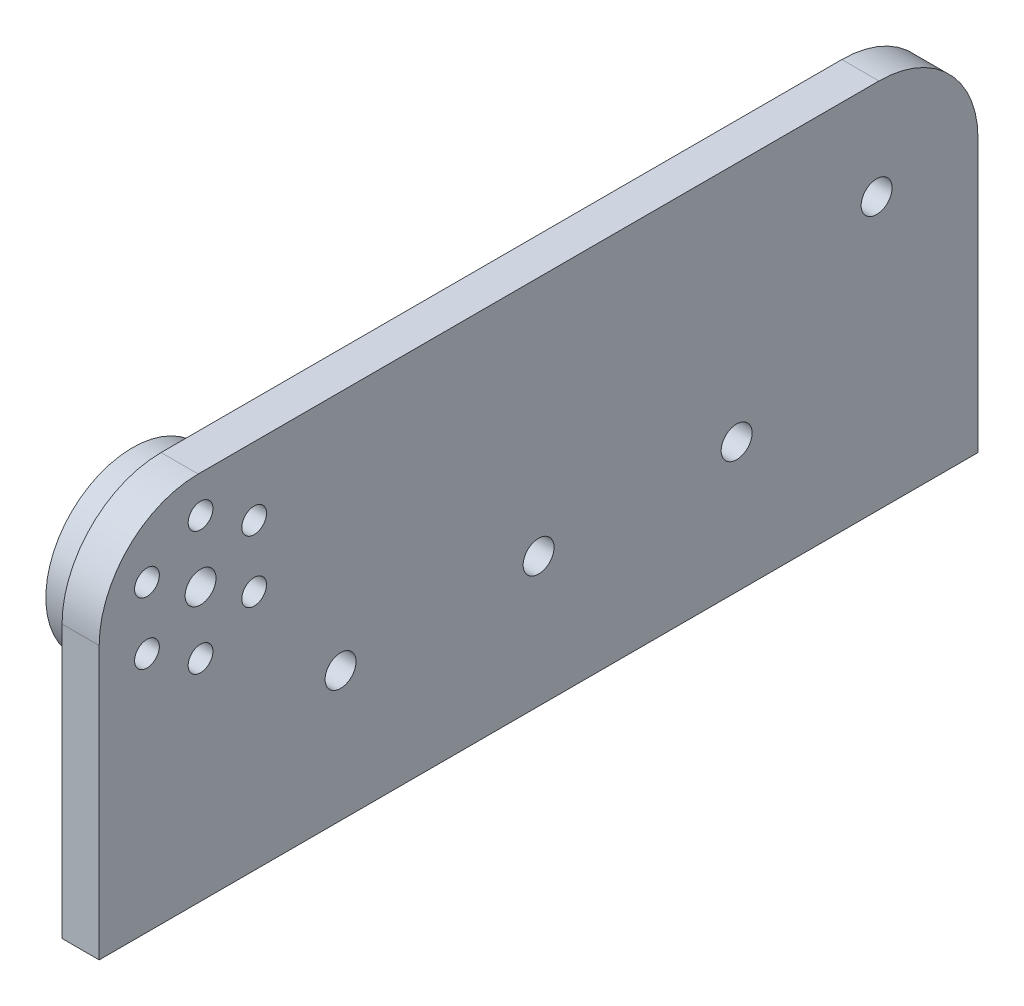
ISO-10303-21;
HEADER;
FILE_DESCRIPTION(('STEP AP214'),'2;1');
FILE_NAME('part.step','',(''),(''),'','','');
FILE_SCHEMA(('AUTOMOTIVE_DESIGN { 1 0 10303 214 1 1 1 1 }'));
ENDSEC;
DATA;
#1=APPLICATION_CONTEXT('core data for automotive mechanical design processes');
#2=APPLICATION_PROTOCOL_DEFINITION('international standard','automotive_design',2000,#1);
#3=PRODUCT_CONTEXT('',#1,'mechanical');
#4=PRODUCT('Part','Part','',(#3));
#5=PRODUCT_RELATED_PRODUCT_CATEGORY('part','',(#4));
#6=PRODUCT_DEFINITION_FORMATION('','',#4);
#7=PRODUCT_DEFINITION_CONTEXT('part definition',#1,'design');
#8=PRODUCT_DEFINITION('design','',#6,#7);
#9=PRODUCT_DEFINITION_SHAPE('','',#8);
#10=(LENGTH_UNIT() NAMED_UNIT(*) SI_UNIT(.MILLI.,.METRE.));
#11=(NAMED_UNIT(*) PLANE_ANGLE_UNIT() SI_UNIT($,.RADIAN.));
#12=(NAMED_UNIT(*) SI_UNIT($,.STERADIAN.) SOLID_ANGLE_UNIT());
#13=UNCERTAINTY_MEASURE_WITH_UNIT(LENGTH_MEASURE(1.E-05),#10,'distance_accuracy_value','');
#14=(GEOMETRIC_REPRESENTATION_CONTEXT(3) GLOBAL_UNCERTAINTY_ASSIGNED_CONTEXT((#13)) GLOBAL_UNIT_ASSIGNED_CONTEXT((#10,
#11,#12)) REPRESENTATION_CONTEXT('',''));
#15=CARTESIAN_POINT('',(0.,0.,0.));
#16=DIRECTION('',(0.,0.,1.));
#17=DIRECTION('',(1.,0.,0.));
#18=AXIS2_PLACEMENT_3D('',#15,#16,#17);
#19=CARTESIAN_POINT('',(3.,-15.,35.5));
#20=DIRECTION('',(0.,0.,-1.));
#21=DIRECTION('',(-1.,0.,0.));
#22=AXIS2_PLACEMENT_3D('',#19,#20,#21);
#23=PLANE('',#22);
#24=DIRECTION('',(0.,-1.,0.));
#25=VECTOR('',#24,1.);
#26=CARTESIAN_POINT('',(3.,-15.,35.5));
#27=LINE('',#26,#25);
#28=CARTESIAN_POINT('',(3.,6.99999999999999,35.5));
#29=VERTEX_POINT('',#28);
#30=CARTESIAN_POINT('',(3.,-15.,35.5));
#31=VERTEX_POINT('',#30);
#32=EDGE_CURVE('E89',#29,#31,#27,.T.);
#33=ORIENTED_EDGE('',*,*,#32,.F.);
#34=DIRECTION('',(-1.,0.,0.));
#35=VECTOR('',#34,1.);
#36=CARTESIAN_POINT('',(3.,6.99999999999999,35.5));
#37=LINE('',#36,#35);
#38=CARTESIAN_POINT('',(0.,6.99999999999999,35.5));
#39=VERTEX_POINT('',#38);
#40=EDGE_CURVE('E11',#29,#39,#37,.T.);
#41=ORIENTED_EDGE('',*,*,#40,.T.);
#42=DIRECTION('',(0.,-1.,0.));
#43=VECTOR('',#42,1.);
#44=CARTESIAN_POINT('',(0.,-15.,35.5));
#45=LINE('',#44,#43);
#46=CARTESIAN_POINT('',(0.,-15.,35.5));
#47=VERTEX_POINT('',#46);
#48=EDGE_CURVE('E108',#39,#47,#45,.T.);
#49=ORIENTED_EDGE('',*,*,#48,.T.);
#50=DIRECTION('',(-1.,0.,0.));
#51=VECTOR('',#50,1.);
#52=CARTESIAN_POINT('',(3.,-15.,35.5));
#53=LINE('',#52,#51);
#54=EDGE_CURVE('E102',#31,#47,#53,.T.);
#55=ORIENTED_EDGE('',*,*,#54,.F.);
#56=EDGE_LOOP('',(#33,#41,#49,#55));
#57=FACE_BOUND('',#56,.T.);
#58=ADVANCED_FACE('F36',(#57),#23,.F.);
#59=CARTESIAN_POINT('',(3.,-15.,-35.5));
#60=DIRECTION('',(0.,1.,0.));
#61=DIRECTION('',(0.,0.,1.));
#62=AXIS2_PLACEMENT_3D('',#59,#60,#61);
#63=PLANE('',#62);
#64=DIRECTION('',(0.,0.,-1.));
#65=VECTOR('',#64,1.);
#66=CARTESIAN_POINT('',(0.,-15.,-35.5));
#67=LINE('',#66,#65);
#68=CARTESIAN_POINT('',(0.,-15.,-35.5));
#69=VERTEX_POINT('',#68);
#70=EDGE_CURVE('E156',#47,#69,#67,.T.);
#71=ORIENTED_EDGE('',*,*,#70,.T.);
#72=DIRECTION('',(-1.,0.,0.));
#73=VECTOR('',#72,1.);
#74=CARTESIAN_POINT('',(3.,-15.,-35.5));
#75=LINE('',#74,#73);
#76=CARTESIAN_POINT('',(3.,-15.,-35.5));
#77=VERTEX_POINT('',#76);
#78=EDGE_CURVE('E104',#77,#69,#75,.T.);
#79=ORIENTED_EDGE('',*,*,#78,.F.);
#80=DIRECTION('',(0.,0.,-1.));
#81=VECTOR('',#80,1.);
#82=CARTESIAN_POINT('',(3.,-15.,-35.5));
#83=LINE('',#82,#81);
#84=EDGE_CURVE('E92',#31,#77,#83,.T.);
#85=ORIENTED_EDGE('',*,*,#84,.F.);
#86=ORIENTED_EDGE('',*,*,#54,.T.);
#87=EDGE_LOOP('',(#71,#79,#85,#86));
#88=FACE_BOUND('',#87,.T.);
#89=ADVANCED_FACE('F101',(#88),#63,.F.);
#90=CARTESIAN_POINT('',(3.,-15.,-35.5));
#91=DIRECTION('',(0.,0.,1.));
#92=DIRECTION('',(1.,0.,0.));
#93=AXIS2_PLACEMENT_3D('',#90,#91,#92);
#94=PLANE('',#93);
#95=DIRECTION('',(0.,1.,0.));
#96=VECTOR('',#95,1.);
#97=CARTESIAN_POINT('',(0.,-15.,-35.5));
#98=LINE('',#97,#96);
#99=CARTESIAN_POINT('',(0.,7.,-35.5));
#100=VERTEX_POINT('',#99);
#101=EDGE_CURVE('E154',#69,#100,#98,.T.);
#102=ORIENTED_EDGE('',*,*,#101,.T.);
#103=DIRECTION('',(-1.,0.,0.));
#104=VECTOR('',#103,1.);
#105=CARTESIAN_POINT('',(3.,7.,-35.5));
#106=LINE('',#105,#104);
#107=CARTESIAN_POINT('',(3.,7.,-35.5));
#108=VERTEX_POINT('',#107);
#109=EDGE_CURVE('E59',#100,#108,#106,.F.);
#110=ORIENTED_EDGE('',*,*,#109,.T.);
#111=DIRECTION('',(0.,1.,0.));
#112=VECTOR('',#111,1.);
#113=CARTESIAN_POINT('',(3.,-15.,-35.5));
#114=LINE('',#113,#112);
#115=EDGE_CURVE('E105',#77,#108,#114,.T.);
#116=ORIENTED_EDGE('',*,*,#115,.F.);
#117=ORIENTED_EDGE('',*,*,#78,.T.);
#118=EDGE_LOOP('',(#102,#110,#116,#117));
#119=FACE_BOUND('',#118,.T.);
#120=ADVANCED_FACE('F155',(#119),#94,.F.);
#121=CARTESIAN_POINT('',(3.,15.,-35.5));
#122=DIRECTION('',(0.,-1.,0.));
#123=DIRECTION('',(0.,0.,-1.));
#124=AXIS2_PLACEMENT_3D('',#121,#122,#123);
#125=PLANE('',#124);
#126=DIRECTION('',(0.,0.,1.));
#127=VECTOR('',#126,1.);
#128=CARTESIAN_POINT('',(3.,15.,-35.5));
#129=LINE('',#128,#127);
#130=CARTESIAN_POINT('',(3.,15.,-27.5));
#131=VERTEX_POINT('',#130);
#132=CARTESIAN_POINT('',(3.,15.,27.5));
#133=VERTEX_POINT('',#132);
#134=EDGE_CURVE('E114',#131,#133,#129,.T.);
#135=ORIENTED_EDGE('',*,*,#134,.F.);
#136=DIRECTION('',(-1.,0.,0.));
#137=VECTOR('',#136,1.);
#138=CARTESIAN_POINT('',(3.,15.,-27.5));
#139=LINE('',#138,#137);
#140=CARTESIAN_POINT('',(0.,15.,-27.5));
#141=VERTEX_POINT('',#140);
#142=EDGE_CURVE('E112',#131,#141,#139,.T.);
#143=ORIENTED_EDGE('',*,*,#142,.T.);
#144=DIRECTION('',(0.,0.,1.));
#145=VECTOR('',#144,1.);
#146=CARTESIAN_POINT('',(0.,15.,-35.5));
#147=LINE('',#146,#145);
#148=CARTESIAN_POINT('',(0.,15.,27.5));
#149=VERTEX_POINT('',#148);
#150=EDGE_CURVE('E97',#141,#149,#147,.T.);
#151=ORIENTED_EDGE('',*,*,#150,.T.);
#152=DIRECTION('',(-1.,0.,0.));
#153=VECTOR('',#152,1.);
#154=CARTESIAN_POINT('',(3.,15.,27.5));
#155=LINE('',#154,#153);
#156=EDGE_CURVE('E110',#149,#133,#155,.F.);
#157=ORIENTED_EDGE('',*,*,#156,.T.);
#158=EDGE_LOOP('',(#135,#143,#151,#157));
#159=FACE_BOUND('',#158,.T.);
#160=ADVANCED_FACE('F145',(#159),#125,.F.);
#161=CARTESIAN_POINT('',(3.,0.,0.));
#162=DIRECTION('',(1.,0.,0.));
#163=DIRECTION('',(0.,0.,-1.));
#164=AXIS2_PLACEMENT_3D('',#161,#162,#163);
#165=PLANE('',#164);
#166=CARTESIAN_POINT('',(3.,9.50000000000004,22.9798729810778));
#167=DIRECTION('',(1.,0.,0.));
#168=DIRECTION('',(0.,0.,-1.));
#169=AXIS2_PLACEMENT_3D('',#166,#167,#168);
#170=CIRCLE('',#169,1.);
#171=CARTESIAN_POINT('',(3.,9.50000000000004,21.9798729810778));
#172=VERTEX_POINT('',#171);
#173=EDGE_CURVE('E189',#172,#172,#170,.T.);
#174=ORIENTED_EDGE('',*,*,#173,.F.);
#175=EDGE_LOOP('',(#174));
#176=FACE_BOUND('',#175,.T.);
#177=CARTESIAN_POINT('',(3.,4.50000000000003,22.9798729810778));
#178=DIRECTION('',(1.,0.,0.));
#179=DIRECTION('',(0.,0.,-1.));
#180=AXIS2_PLACEMENT_3D('',#177,#178,#179);
#181=CIRCLE('',#180,1.);
#182=CARTESIAN_POINT('',(3.,4.50000000000003,21.9798729810778));
#183=VERTEX_POINT('',#182);
#184=EDGE_CURVE('E192',#183,#183,#181,.T.);
#185=ORIENTED_EDGE('',*,*,#184,.F.);
#186=EDGE_LOOP('',(#185));
#187=FACE_BOUND('',#186,.T.);
#188=CARTESIAN_POINT('',(3.,1.99999999999999,27.31));
#189=DIRECTION('',(1.,0.,0.));
#190=DIRECTION('',(0.,0.,-1.));
#191=AXIS2_PLACEMENT_3D('',#188,#189,#190);
#192=CIRCLE('',#191,1.);
#193=CARTESIAN_POINT('',(3.,1.99999999999999,26.31));
#194=VERTEX_POINT('',#193);
#195=EDGE_CURVE('E195',#194,#194,#192,.T.);
#196=ORIENTED_EDGE('',*,*,#195,.F.);
#197=EDGE_LOOP('',(#196));
#198=FACE_BOUND('',#197,.T.);
#199=CARTESIAN_POINT('',(3.,4.49999999999997,31.6401270189222));
#200=DIRECTION('',(1.,0.,0.));
#201=DIRECTION('',(0.,0.,-1.));
#202=AXIS2_PLACEMENT_3D('',#199,#200,#201);
#203=CIRCLE('',#202,1.);
#204=CARTESIAN_POINT('',(3.,4.49999999999997,30.6401270189222));
#205=VERTEX_POINT('',#204);
#206=EDGE_CURVE('E198',#205,#205,#203,.T.);
#207=ORIENTED_EDGE('',*,*,#206,.F.);
#208=EDGE_LOOP('',(#207));
#209=FACE_BOUND('',#208,.T.);
#210=CARTESIAN_POINT('',(3.,9.49999999999998,31.6401270189222));
#211=DIRECTION('',(1.,0.,0.));
#212=DIRECTION('',(0.,0.,-1.));
#213=AXIS2_PLACEMENT_3D('',#210,#211,#212);
#214=CIRCLE('',#213,1.);
#215=CARTESIAN_POINT('',(3.,9.49999999999998,30.6401270189222));
#216=VERTEX_POINT('',#215);
#217=EDGE_CURVE('E201',#216,#216,#214,.T.);
#218=ORIENTED_EDGE('',*,*,#217,.F.);
#219=EDGE_LOOP('',(#218));
#220=FACE_BOUND('',#219,.T.);
#221=CARTESIAN_POINT('',(3.,12.,27.31));
#222=DIRECTION('',(1.,0.,0.));
#223=DIRECTION('',(0.,0.,-1.));
#224=AXIS2_PLACEMENT_3D('',#221,#222,#223);
#225=CIRCLE('',#224,1.);
#226=CARTESIAN_POINT('',(3.,12.,26.31));
#227=VERTEX_POINT('',#226);
#228=EDGE_CURVE('E183',#227,#227,#225,.T.);
#229=ORIENTED_EDGE('',*,*,#228,.F.);
#230=EDGE_LOOP('',(#229));
#231=FACE_BOUND('',#230,.T.);
#232=CARTESIAN_POINT('',(3.,6.99999999999999,-27.31));
#233=DIRECTION('',(-1.,0.,0.));
#234=DIRECTION('',(0.,0.,1.));
#235=AXIS2_PLACEMENT_3D('',#232,#233,#234);
#236=CIRCLE('',#235,1.25);
#237=CARTESIAN_POINT('',(3.,6.99999999999999,-26.06));
#238=VERTEX_POINT('',#237);
#239=EDGE_CURVE('E129',#238,#238,#236,.T.);
#240=ORIENTED_EDGE('',*,*,#239,.T.);
#241=EDGE_LOOP('',(#240));
#242=FACE_BOUND('',#241,.T.);
#243=CARTESIAN_POINT('',(3.,-4.50000000000001,-16.));
#244=DIRECTION('',(-1.,0.,0.));
#245=DIRECTION('',(0.,0.,1.));
#246=AXIS2_PLACEMENT_3D('',#243,#244,#245);
#247=CIRCLE('',#246,1.25);
#248=CARTESIAN_POINT('',(3.,-4.50000000000001,-14.75));
#249=VERTEX_POINT('',#248);
#250=EDGE_CURVE('E169',#249,#249,#247,.T.);
#251=ORIENTED_EDGE('',*,*,#250,.T.);
#252=EDGE_LOOP('',(#251));
#253=FACE_BOUND('',#252,.T.);
#254=CARTESIAN_POINT('',(3.,6.99999999999999,27.31));
#255=DIRECTION('',(1.,0.,0.));
#256=DIRECTION('',(0.,0.,-1.));
#257=AXIS2_PLACEMENT_3D('',#254,#255,#256);
#258=CIRCLE('',#257,1.25);
#259=CARTESIAN_POINT('',(3.,6.99999999999999,26.06));
#260=VERTEX_POINT('',#259);
#261=EDGE_CURVE('E122',#260,#260,#258,.T.);
#262=ORIENTED_EDGE('',*,*,#261,.F.);
#263=EDGE_LOOP('',(#262));
#264=FACE_BOUND('',#263,.T.);
#265=CARTESIAN_POINT('',(3.,-4.50000000000001,0.));
#266=DIRECTION('',(1.,0.,0.));
#267=DIRECTION('',(0.,0.,-1.));
#268=AXIS2_PLACEMENT_3D('',#265,#266,#267);
#269=CIRCLE('',#268,1.25);
#270=CARTESIAN_POINT('',(3.,-4.50000000000001,-1.25));
#271=VERTEX_POINT('',#270);
#272=EDGE_CURVE('E164',#271,#271,#269,.T.);
#273=ORIENTED_EDGE('',*,*,#272,.F.);
#274=EDGE_LOOP('',(#273));
#275=FACE_BOUND('',#274,.T.);
#276=CARTESIAN_POINT('',(3.,-4.50000000000001,16.));
#277=DIRECTION('',(1.,0.,0.));
#278=DIRECTION('',(0.,0.,-1.));
#279=AXIS2_PLACEMENT_3D('',#276,#277,#278);
#280=CIRCLE('',#279,1.25);
#281=CARTESIAN_POINT('',(3.,-4.50000000000001,14.75));
#282=VERTEX_POINT('',#281);
#283=EDGE_CURVE('E131',#282,#282,#280,.T.);
#284=ORIENTED_EDGE('',*,*,#283,.F.);
#285=EDGE_LOOP('',(#284));
#286=FACE_BOUND('',#285,.T.);
#287=ORIENTED_EDGE('',*,*,#115,.T.);
#288=CARTESIAN_POINT('',(3.,7.,-27.5));
#289=DIRECTION('',(1.,0.,0.));
#290=DIRECTION('',(0.,0.,-1.));
#291=AXIS2_PLACEMENT_3D('',#288,#289,#290);
#292=CIRCLE('',#291,8.);
#293=EDGE_CURVE('E44',#108,#131,#292,.T.);
#294=ORIENTED_EDGE('',*,*,#293,.T.);
#295=ORIENTED_EDGE('',*,*,#134,.T.);
#296=CARTESIAN_POINT('',(3.,6.99999999999999,27.5));
#297=DIRECTION('',(1.,0.,0.));
#298=DIRECTION('',(0.,0.,-1.));
#299=AXIS2_PLACEMENT_3D('',#296,#297,#298);
#300=CIRCLE('',#299,8.);
#301=EDGE_CURVE('E51',#133,#29,#300,.T.);
#302=ORIENTED_EDGE('',*,*,#301,.T.);
#303=ORIENTED_EDGE('',*,*,#32,.T.);
#304=ORIENTED_EDGE('',*,*,#84,.T.);
#305=EDGE_LOOP('',(#287,#294,#295,#302,#303,#304));
#306=FACE_BOUND('',#305,.T.);
#307=ADVANCED_FACE('F91',(#176,#187,#198,#209,#220,#231,#242,#253,#264,#275,#286,#306),#165,.T.);
#308=CARTESIAN_POINT('',(0.,0.,0.));
#309=DIRECTION('',(1.,0.,0.));
#310=DIRECTION('',(0.,0.,-1.));
#311=AXIS2_PLACEMENT_3D('',#308,#309,#310);
#312=PLANE('',#311);
#313=CARTESIAN_POINT('',(0.,6.99999999999999,27.31));
#314=DIRECTION('',(1.,0.,0.));
#315=DIRECTION('',(0.,0.,-1.));
#316=AXIS2_PLACEMENT_3D('',#313,#314,#315);
#317=CIRCLE('',#316,7.);
#318=CARTESIAN_POINT('',(0.,6.99999999999999,20.31));
#319=VERTEX_POINT('',#318);
#320=EDGE_CURVE('E175',#319,#319,#317,.T.);
#321=ORIENTED_EDGE('',*,*,#320,.T.);
#322=EDGE_LOOP('',(#321));
#323=FACE_BOUND('',#322,.T.);
#324=CARTESIAN_POINT('',(0.,6.99999999999999,-27.31));
#325=DIRECTION('',(1.,0.,0.));
#326=DIRECTION('',(0.,0.,-1.));
#327=AXIS2_PLACEMENT_3D('',#324,#325,#326);
#328=CIRCLE('',#327,1.25);
#329=CARTESIAN_POINT('',(0.,6.99999999999999,-28.56));
#330=VERTEX_POINT('',#329);
#331=EDGE_CURVE('E128',#330,#330,#328,.F.);
#332=ORIENTED_EDGE('',*,*,#331,.F.);
#333=EDGE_LOOP('',(#332));
#334=FACE_BOUND('',#333,.T.);
#335=CARTESIAN_POINT('',(0.,-4.50000000000001,-16.));
#336=DIRECTION('',(1.,0.,0.));
#337=DIRECTION('',(0.,0.,-1.));
#338=AXIS2_PLACEMENT_3D('',#335,#336,#337);
#339=CIRCLE('',#338,1.25);
#340=CARTESIAN_POINT('',(0.,-4.50000000000001,-17.25));
#341=VERTEX_POINT('',#340);
#342=EDGE_CURVE('E125',#341,#341,#339,.F.);
#343=ORIENTED_EDGE('',*,*,#342,.F.);
#344=EDGE_LOOP('',(#343));
#345=FACE_BOUND('',#344,.T.);
#346=CARTESIAN_POINT('',(0.,-4.50000000000001,0.));
#347=DIRECTION('',(1.,0.,0.));
#348=DIRECTION('',(0.,0.,-1.));
#349=AXIS2_PLACEMENT_3D('',#346,#347,#348);
#350=CIRCLE('',#349,1.25);
#351=CARTESIAN_POINT('',(0.,-4.50000000000001,-1.25));
#352=VERTEX_POINT('',#351);
#353=EDGE_CURVE('E121',#352,#352,#350,.T.);
#354=ORIENTED_EDGE('',*,*,#353,.T.);
#355=EDGE_LOOP('',(#354));
#356=FACE_BOUND('',#355,.T.);
#357=CARTESIAN_POINT('',(0.,-4.50000000000001,16.));
#358=DIRECTION('',(1.,0.,0.));
#359=DIRECTION('',(0.,0.,-1.));
#360=AXIS2_PLACEMENT_3D('',#357,#358,#359);
#361=CIRCLE('',#360,1.25);
#362=CARTESIAN_POINT('',(0.,-4.50000000000001,14.75));
#363=VERTEX_POINT('',#362);
#364=EDGE_CURVE('E118',#363,#363,#361,.T.);
#365=ORIENTED_EDGE('',*,*,#364,.T.);
#366=EDGE_LOOP('',(#365));
#367=FACE_BOUND('',#366,.T.);
#368=ORIENTED_EDGE('',*,*,#150,.F.);
#369=CARTESIAN_POINT('',(0.,7.,-27.5));
#370=DIRECTION('',(1.,0.,0.));
#371=DIRECTION('',(0.,0.,-1.));
#372=AXIS2_PLACEMENT_3D('',#369,#370,#371);
#373=CIRCLE('',#372,8.);
#374=EDGE_CURVE('E137',#141,#100,#373,.F.);
#375=ORIENTED_EDGE('',*,*,#374,.T.);
#376=ORIENTED_EDGE('',*,*,#101,.F.);
#377=ORIENTED_EDGE('',*,*,#70,.F.);
#378=ORIENTED_EDGE('',*,*,#48,.F.);
#379=CARTESIAN_POINT('',(0.,6.99999999999999,27.5));
#380=DIRECTION('',(1.,0.,0.));
#381=DIRECTION('',(0.,0.,-1.));
#382=AXIS2_PLACEMENT_3D('',#379,#380,#381);
#383=CIRCLE('',#382,8.);
#384=EDGE_CURVE('E135',#39,#149,#383,.F.);
#385=ORIENTED_EDGE('',*,*,#384,.T.);
#386=EDGE_LOOP('',(#368,#375,#376,#377,#378,#385));
#387=FACE_BOUND('',#386,.T.);
#388=ADVANCED_FACE('F153',(#323,#334,#345,#356,#367,#387),#312,.F.);
#389=CARTESIAN_POINT('',(-2.,-4.50000000000001,16.));
#390=DIRECTION('',(1.,0.,0.));
#391=DIRECTION('',(0.,0.,-1.));
#392=AXIS2_PLACEMENT_3D('',#389,#390,#391);
#393=CYLINDRICAL_SURFACE('',#392,1.25);
#394=ORIENTED_EDGE('',*,*,#283,.T.);
#395=EDGE_LOOP('',(#394));
#396=FACE_BOUND('',#395,.T.);
#397=ORIENTED_EDGE('',*,*,#364,.F.);
#398=EDGE_LOOP('',(#397));
#399=FACE_BOUND('',#398,.T.);
#400=ADVANCED_FACE('F244',(#396,#399),#393,.F.);
#401=CARTESIAN_POINT('',(-2.,-4.50000000000001,0.));
#402=DIRECTION('',(1.,0.,0.));
#403=DIRECTION('',(0.,0.,-1.));
#404=AXIS2_PLACEMENT_3D('',#401,#402,#403);
#405=CYLINDRICAL_SURFACE('',#404,1.25);
#406=ORIENTED_EDGE('',*,*,#272,.T.);
#407=EDGE_LOOP('',(#406));
#408=FACE_BOUND('',#407,.T.);
#409=ORIENTED_EDGE('',*,*,#353,.F.);
#410=EDGE_LOOP('',(#409));
#411=FACE_BOUND('',#410,.T.);
#412=ADVANCED_FACE('F255',(#408,#411),#405,.F.);
#413=CARTESIAN_POINT('',(-2.,6.99999999999999,27.31));
#414=DIRECTION('',(1.,0.,0.));
#415=DIRECTION('',(0.,0.,-1.));
#416=AXIS2_PLACEMENT_3D('',#413,#414,#415);
#417=CYLINDRICAL_SURFACE('',#416,1.25);
#418=ORIENTED_EDGE('',*,*,#261,.T.);
#419=EDGE_LOOP('',(#418));
#420=FACE_BOUND('',#419,.T.);
#421=CARTESIAN_POINT('',(-2.5,6.99999999999999,27.31));
#422=DIRECTION('',(1.,0.,0.));
#423=DIRECTION('',(0.,0.,-1.));
#424=AXIS2_PLACEMENT_3D('',#421,#422,#423);
#425=CIRCLE('',#424,1.25);
#426=CARTESIAN_POINT('',(-2.5,6.99999999999999,26.06));
#427=VERTEX_POINT('',#426);
#428=EDGE_CURVE('E178',#427,#427,#425,.T.);
#429=ORIENTED_EDGE('',*,*,#428,.F.);
#430=EDGE_LOOP('',(#429));
#431=FACE_BOUND('',#430,.T.);
#432=ADVANCED_FACE('F261',(#420,#431),#417,.F.);
#433=CARTESIAN_POINT('',(-2.,-4.50000000000001,-16.));
#434=DIRECTION('',(1.,0.,0.));
#435=DIRECTION('',(0.,0.,-1.));
#436=AXIS2_PLACEMENT_3D('',#433,#434,#435);
#437=CYLINDRICAL_SURFACE('',#436,1.25);
#438=ORIENTED_EDGE('',*,*,#250,.F.);
#439=EDGE_LOOP('',(#438));
#440=FACE_BOUND('',#439,.T.);
#441=ORIENTED_EDGE('',*,*,#342,.T.);
#442=EDGE_LOOP('',(#441));
#443=FACE_BOUND('',#442,.T.);
#444=ADVANCED_FACE('F279',(#440,#443),#437,.F.);
#445=CARTESIAN_POINT('',(-2.,6.99999999999999,-27.31));
#446=DIRECTION('',(1.,0.,0.));
#447=DIRECTION('',(0.,0.,-1.));
#448=AXIS2_PLACEMENT_3D('',#445,#446,#447);
#449=CYLINDRICAL_SURFACE('',#448,1.25);
#450=ORIENTED_EDGE('',*,*,#239,.F.);
#451=EDGE_LOOP('',(#450));
#452=FACE_BOUND('',#451,.T.);
#453=ORIENTED_EDGE('',*,*,#331,.T.);
#454=EDGE_LOOP('',(#453));
#455=FACE_BOUND('',#454,.T.);
#456=ADVANCED_FACE('F273',(#452,#455),#449,.F.);
#457=CARTESIAN_POINT('',(3.,7.,-27.5));
#458=DIRECTION('',(-1.,0.,0.));
#459=DIRECTION('',(0.,0.,1.));
#460=AXIS2_PLACEMENT_3D('',#457,#458,#459);
#461=CYLINDRICAL_SURFACE('',#460,8.);
#462=ORIENTED_EDGE('',*,*,#293,.F.);
#463=ORIENTED_EDGE('',*,*,#109,.F.);
#464=ORIENTED_EDGE('',*,*,#374,.F.);
#465=ORIENTED_EDGE('',*,*,#142,.F.);
#466=EDGE_LOOP('',(#462,#463,#464,#465));
#467=FACE_BOUND('',#466,.T.);
#468=ADVANCED_FACE('F150',(#467),#461,.T.);
#469=CARTESIAN_POINT('',(3.,6.99999999999999,27.5));
#470=DIRECTION('',(-1.,0.,0.));
#471=DIRECTION('',(0.,0.,1.));
#472=AXIS2_PLACEMENT_3D('',#469,#470,#471);
#473=CYLINDRICAL_SURFACE('',#472,8.);
#474=ORIENTED_EDGE('',*,*,#301,.F.);
#475=ORIENTED_EDGE('',*,*,#156,.F.);
#476=ORIENTED_EDGE('',*,*,#384,.F.);
#477=ORIENTED_EDGE('',*,*,#40,.F.);
#478=EDGE_LOOP('',(#474,#475,#476,#477));
#479=FACE_BOUND('',#478,.T.);
#480=ADVANCED_FACE('F38',(#479),#473,.T.);
#481=CARTESIAN_POINT('',(-2.5,6.99999999999999,27.31));
#482=DIRECTION('',(1.,0.,0.));
#483=DIRECTION('',(0.,0.,-1.));
#484=AXIS2_PLACEMENT_3D('',#481,#482,#483);
#485=CYLINDRICAL_SURFACE('',#484,7.);
#486=CARTESIAN_POINT('',(-2.5,6.99999999999999,27.31));
#487=DIRECTION('',(1.,0.,0.));
#488=DIRECTION('',(0.,0.,-1.));
#489=AXIS2_PLACEMENT_3D('',#486,#487,#488);
#490=CIRCLE('',#489,7.);
#491=CARTESIAN_POINT('',(-2.5,6.99999999999999,20.31));
#492=VERTEX_POINT('',#491);
#493=EDGE_CURVE('E172',#492,#492,#490,.T.);
#494=ORIENTED_EDGE('',*,*,#493,.T.);
#495=EDGE_LOOP('',(#494));
#496=FACE_BOUND('',#495,.T.);
#497=ORIENTED_EDGE('',*,*,#320,.F.);
#498=EDGE_LOOP('',(#497));
#499=FACE_BOUND('',#498,.T.);
#500=ADVANCED_FACE('F226',(#496,#499),#485,.T.);
#501=CARTESIAN_POINT('',(-2.5,6.99999999999999,27.31));
#502=DIRECTION('',(1.,0.,0.));
#503=DIRECTION('',(0.,0.,-1.));
#504=AXIS2_PLACEMENT_3D('',#501,#502,#503);
#505=PLANE('',#504);
#506=CARTESIAN_POINT('',(-2.5,9.50000000000004,22.9798729810778));
#507=DIRECTION('',(-1.,0.,0.));
#508=DIRECTION('',(0.,0.866025403784433,0.50000000000001));
#509=AXIS2_PLACEMENT_3D('',#506,#507,#508);
#510=CIRCLE('',#509,1.);
#511=CARTESIAN_POINT('',(-2.5,10.3660254037845,23.4798729810778));
#512=VERTEX_POINT('',#511);
#513=EDGE_CURVE('E208',#512,#512,#510,.T.);
#514=ORIENTED_EDGE('',*,*,#513,.F.);
#515=EDGE_LOOP('',(#514));
#516=FACE_BOUND('',#515,.T.);
#517=CARTESIAN_POINT('',(-2.5,4.50000000000003,22.9798729810778));
#518=DIRECTION('',(-1.,0.,0.));
#519=DIRECTION('',(0.,0.866025403784443,-0.499999999999992));
#520=AXIS2_PLACEMENT_3D('',#517,#518,#519);
#521=CIRCLE('',#520,1.);
#522=CARTESIAN_POINT('',(-2.5,5.36602540378448,22.4798729810778));
#523=VERTEX_POINT('',#522);
#524=EDGE_CURVE('E211',#523,#523,#521,.T.);
#525=ORIENTED_EDGE('',*,*,#524,.F.);
#526=EDGE_LOOP('',(#525));
#527=FACE_BOUND('',#526,.T.);
#528=CARTESIAN_POINT('',(-2.5,1.99999999999999,27.31));
#529=DIRECTION('',(-1.,0.,0.));
#530=DIRECTION('',(0.,0.,-1.));
#531=AXIS2_PLACEMENT_3D('',#528,#529,#530);
#532=CIRCLE('',#531,1.);
#533=CARTESIAN_POINT('',(-2.5,1.99999999999999,26.31));
#534=VERTEX_POINT('',#533);
#535=EDGE_CURVE('E214',#534,#534,#532,.T.);
#536=ORIENTED_EDGE('',*,*,#535,.F.);
#537=EDGE_LOOP('',(#536));
#538=FACE_BOUND('',#537,.T.);
#539=CARTESIAN_POINT('',(-2.5,4.49999999999997,31.6401270189222));
#540=DIRECTION('',(-1.,0.,0.));
#541=DIRECTION('',(0.,-0.866025403784436,-0.500000000000004));
#542=AXIS2_PLACEMENT_3D('',#539,#540,#541);
#543=CIRCLE('',#542,1.);
#544=CARTESIAN_POINT('',(-2.5,3.63397459621553,31.1401270189222));
#545=VERTEX_POINT('',#544);
#546=EDGE_CURVE('E207',#545,#545,#543,.T.);
#547=ORIENTED_EDGE('',*,*,#546,.F.);
#548=EDGE_LOOP('',(#547));
#549=FACE_BOUND('',#548,.T.);
#550=CARTESIAN_POINT('',(-2.5,9.49999999999998,31.6401270189222));
#551=DIRECTION('',(-1.,0.,0.));
#552=DIRECTION('',(0.,-0.86602540378444,0.499999999999998));
#553=AXIS2_PLACEMENT_3D('',#550,#551,#552);
#554=CIRCLE('',#553,1.);
#555=CARTESIAN_POINT('',(-2.5,8.63397459621554,32.1401270189222));
#556=VERTEX_POINT('',#555);
#557=EDGE_CURVE('E204',#556,#556,#554,.T.);
#558=ORIENTED_EDGE('',*,*,#557,.F.);
#559=EDGE_LOOP('',(#558));
#560=FACE_BOUND('',#559,.T.);
#561=CARTESIAN_POINT('',(-2.5,12.,27.31));
#562=DIRECTION('',(-1.,0.,0.));
#563=DIRECTION('',(0.,0.,1.));
#564=AXIS2_PLACEMENT_3D('',#561,#562,#563);
#565=CIRCLE('',#564,1.);
#566=CARTESIAN_POINT('',(-2.5,12.,28.31));
#567=VERTEX_POINT('',#566);
#568=EDGE_CURVE('E186',#567,#567,#565,.T.);
#569=ORIENTED_EDGE('',*,*,#568,.F.);
#570=EDGE_LOOP('',(#569));
#571=FACE_BOUND('',#570,.T.);
#572=ORIENTED_EDGE('',*,*,#428,.T.);
#573=EDGE_LOOP('',(#572));
#574=FACE_BOUND('',#573,.T.);
#575=ORIENTED_EDGE('',*,*,#493,.F.);
#576=EDGE_LOOP('',(#575));
#577=FACE_BOUND('',#576,.T.);
#578=ADVANCED_FACE('F222',(#516,#527,#538,#549,#560,#571,#574,#577),#505,.F.);
#579=CARTESIAN_POINT('',(7.5,12.,27.31));
#580=DIRECTION('',(-1.,0.,0.));
#581=DIRECTION('',(0.,0.,1.));
#582=AXIS2_PLACEMENT_3D('',#579,#580,#581);
#583=CYLINDRICAL_SURFACE('',#582,1.);
#584=ORIENTED_EDGE('',*,*,#228,.T.);
#585=EDGE_LOOP('',(#584));
#586=FACE_BOUND('',#585,.T.);
#587=ORIENTED_EDGE('',*,*,#568,.T.);
#588=EDGE_LOOP('',(#587));
#589=FACE_BOUND('',#588,.T.);
#590=ADVANCED_FACE('F225',(#586,#589),#583,.F.);
#591=CARTESIAN_POINT('',(7.5,9.49999999999998,31.6401270189222));
#592=DIRECTION('',(-1.,0.,0.));
#593=DIRECTION('',(0.,0.,1.));
#594=AXIS2_PLACEMENT_3D('',#591,#592,#593);
#595=CYLINDRICAL_SURFACE('',#594,1.);
#596=ORIENTED_EDGE('',*,*,#217,.T.);
#597=EDGE_LOOP('',(#596));
#598=FACE_BOUND('',#597,.T.);
#599=ORIENTED_EDGE('',*,*,#557,.T.);
#600=EDGE_LOOP('',(#599));
#601=FACE_BOUND('',#600,.T.);
#602=ADVANCED_FACE('F358',(#598,#601),#595,.F.);
#603=CARTESIAN_POINT('',(7.5,4.49999999999997,31.6401270189222));
#604=DIRECTION('',(-1.,0.,0.));
#605=DIRECTION('',(0.,0.,1.));
#606=AXIS2_PLACEMENT_3D('',#603,#604,#605);
#607=CYLINDRICAL_SURFACE('',#606,1.);
#608=ORIENTED_EDGE('',*,*,#206,.T.);
#609=EDGE_LOOP('',(#608));
#610=FACE_BOUND('',#609,.T.);
#611=ORIENTED_EDGE('',*,*,#546,.T.);
#612=EDGE_LOOP('',(#611));
#613=FACE_BOUND('',#612,.T.);
#614=ADVANCED_FACE('F220',(#610,#613),#607,.F.);
#615=CARTESIAN_POINT('',(7.5,1.99999999999999,27.31));
#616=DIRECTION('',(-1.,0.,0.));
#617=DIRECTION('',(0.,0.,1.));
#618=AXIS2_PLACEMENT_3D('',#615,#616,#617);
#619=CYLINDRICAL_SURFACE('',#618,1.);
#620=ORIENTED_EDGE('',*,*,#195,.T.);
#621=EDGE_LOOP('',(#620));
#622=FACE_BOUND('',#621,.T.);
#623=ORIENTED_EDGE('',*,*,#535,.T.);
#624=EDGE_LOOP('',(#623));
#625=FACE_BOUND('',#624,.T.);
#626=ADVANCED_FACE('F386',(#622,#625),#619,.F.);
#627=CARTESIAN_POINT('',(7.5,4.50000000000003,22.9798729810778));
#628=DIRECTION('',(-1.,0.,0.));
#629=DIRECTION('',(0.,0.,1.));
#630=AXIS2_PLACEMENT_3D('',#627,#628,#629);
#631=CYLINDRICAL_SURFACE('',#630,1.);
#632=ORIENTED_EDGE('',*,*,#184,.T.);
#633=EDGE_LOOP('',(#632));
#634=FACE_BOUND('',#633,.T.);
#635=ORIENTED_EDGE('',*,*,#524,.T.);
#636=EDGE_LOOP('',(#635));
#637=FACE_BOUND('',#636,.T.);
#638=ADVANCED_FACE('F396',(#634,#637),#631,.F.);
#639=CARTESIAN_POINT('',(7.5,9.50000000000004,22.9798729810778));
#640=DIRECTION('',(-1.,0.,0.));
#641=DIRECTION('',(0.,0.,1.));
#642=AXIS2_PLACEMENT_3D('',#639,#640,#641);
#643=CYLINDRICAL_SURFACE('',#642,1.);
#644=ORIENTED_EDGE('',*,*,#173,.T.);
#645=EDGE_LOOP('',(#644));
#646=FACE_BOUND('',#645,.T.);
#647=ORIENTED_EDGE('',*,*,#513,.T.);
#648=EDGE_LOOP('',(#647));
#649=FACE_BOUND('',#648,.T.);
#650=ADVANCED_FACE('F406',(#646,#649),#643,.F.);
#651=CLOSED_SHELL('',(#58,#89,#120,#160,#307,#388,#400,#412,#432,#444,#456,#468,#480,#500,#578,
#590,#602,#614,#626,#638,#650));
#652=MANIFOLD_SOLID_BREP('B2',#651);
#653=ADVANCED_BREP_SHAPE_REPRESENTATION('',(#18,#652),#14);
#654=SHAPE_DEFINITION_REPRESENTATION(#9,#653);
ENDSEC;
END-ISO-10303-21;
